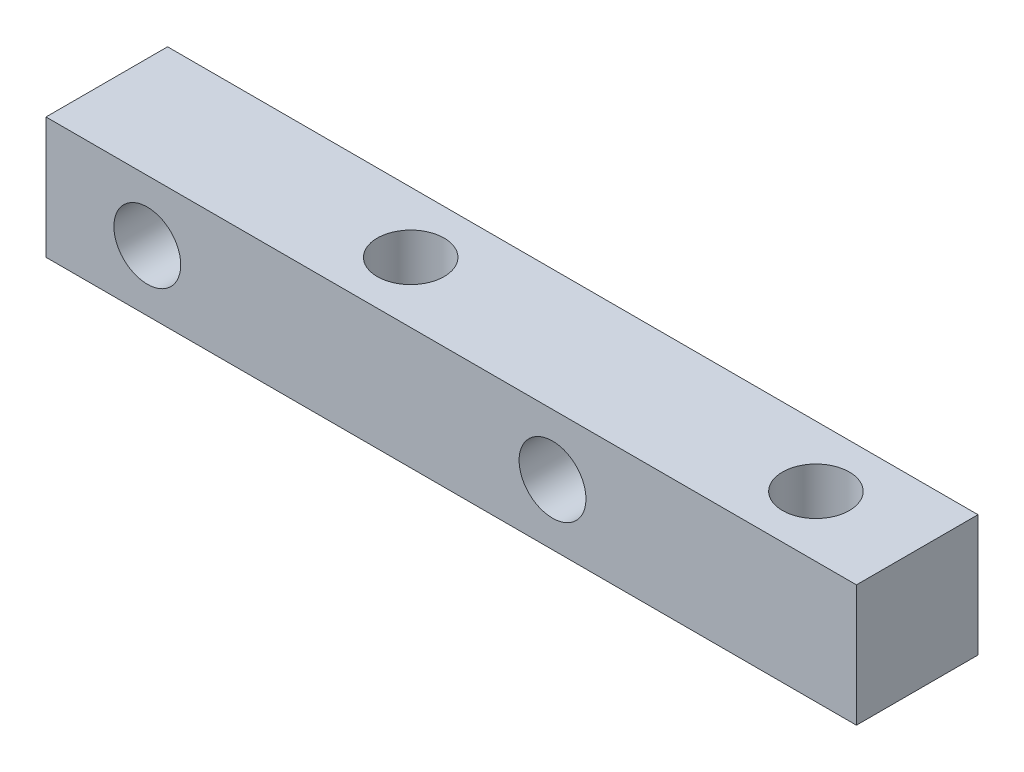
ISO-10303-21;
HEADER;
FILE_DESCRIPTION(('STEP AP214'),'2;1');
FILE_NAME('part.step','',(''),(''),'','','');
FILE_SCHEMA(('AUTOMOTIVE_DESIGN { 1 0 10303 214 1 1 1 1 }'));
ENDSEC;
DATA;
#1=APPLICATION_CONTEXT('core data for automotive mechanical design processes');
#2=APPLICATION_PROTOCOL_DEFINITION('international standard','automotive_design',2000,#1);
#3=PRODUCT_CONTEXT('',#1,'mechanical');
#4=PRODUCT('Part','Part','',(#3));
#5=PRODUCT_RELATED_PRODUCT_CATEGORY('part','',(#4));
#6=PRODUCT_DEFINITION_FORMATION('','',#4);
#7=PRODUCT_DEFINITION_CONTEXT('part definition',#1,'design');
#8=PRODUCT_DEFINITION('design','',#6,#7);
#9=PRODUCT_DEFINITION_SHAPE('','',#8);
#10=(LENGTH_UNIT() NAMED_UNIT(*) SI_UNIT(.MILLI.,.METRE.));
#11=(NAMED_UNIT(*) PLANE_ANGLE_UNIT() SI_UNIT($,.RADIAN.));
#12=(NAMED_UNIT(*) SI_UNIT($,.STERADIAN.) SOLID_ANGLE_UNIT());
#13=UNCERTAINTY_MEASURE_WITH_UNIT(LENGTH_MEASURE(1.E-05),#10,'distance_accuracy_value','');
#14=(GEOMETRIC_REPRESENTATION_CONTEXT(3) GLOBAL_UNCERTAINTY_ASSIGNED_CONTEXT((#13)) GLOBAL_UNIT_ASSIGNED_CONTEXT((#10,
#11,#12)) REPRESENTATION_CONTEXT('',''));
#15=CARTESIAN_POINT('',(0.,0.,0.));
#16=DIRECTION('',(0.,0.,1.));
#17=DIRECTION('',(1.,0.,0.));
#18=AXIS2_PLACEMENT_3D('',#15,#16,#17);
#19=CARTESIAN_POINT('',(40.,-3.,3.));
#20=DIRECTION('',(0.,0.,-1.));
#21=DIRECTION('',(-1.,0.,0.));
#22=AXIS2_PLACEMENT_3D('',#19,#20,#21);
#23=PLANE('',#22);
#24=CARTESIAN_POINT('',(5.,0.,3.));
#25=DIRECTION('',(0.,0.,1.));
#26=DIRECTION('',(1.,0.,0.));
#27=AXIS2_PLACEMENT_3D('',#24,#25,#26);
#28=CIRCLE('',#27,1.65);
#29=CARTESIAN_POINT('',(6.65,0.,3.));
#30=VERTEX_POINT('',#29);
#31=EDGE_CURVE('E125',#30,#30,#28,.T.);
#32=ORIENTED_EDGE('',*,*,#31,.F.);
#33=EDGE_LOOP('',(#32));
#34=FACE_BOUND('',#33,.T.);
#35=CARTESIAN_POINT('',(25.,0.,3.));
#36=DIRECTION('',(0.,0.,1.));
#37=DIRECTION('',(1.,0.,0.));
#38=AXIS2_PLACEMENT_3D('',#35,#36,#37);
#39=CIRCLE('',#38,1.65);
#40=CARTESIAN_POINT('',(26.65,0.,3.));
#41=VERTEX_POINT('',#40);
#42=EDGE_CURVE('E121',#41,#41,#39,.T.);
#43=ORIENTED_EDGE('',*,*,#42,.F.);
#44=EDGE_LOOP('',(#43));
#45=FACE_BOUND('',#44,.T.);
#46=DIRECTION('',(0.,-1.,0.));
#47=VECTOR('',#46,1.);
#48=CARTESIAN_POINT('',(0.,-3.,3.));
#49=LINE('',#48,#47);
#50=CARTESIAN_POINT('',(0.,3.,3.));
#51=VERTEX_POINT('',#50);
#52=CARTESIAN_POINT('',(0.,-3.,3.));
#53=VERTEX_POINT('',#52);
#54=EDGE_CURVE('E104',#51,#53,#49,.T.);
#55=ORIENTED_EDGE('',*,*,#54,.T.);
#56=DIRECTION('',(-1.,0.,0.));
#57=VECTOR('',#56,1.);
#58=CARTESIAN_POINT('',(40.,-3.,3.));
#59=LINE('',#58,#57);
#60=CARTESIAN_POINT('',(40.,-3.,3.));
#61=VERTEX_POINT('',#60);
#62=EDGE_CURVE('E11',#61,#53,#59,.T.);
#63=ORIENTED_EDGE('',*,*,#62,.F.);
#64=DIRECTION('',(0.,-1.,0.));
#65=VECTOR('',#64,1.);
#66=CARTESIAN_POINT('',(40.,-3.,3.));
#67=LINE('',#66,#65);
#68=CARTESIAN_POINT('',(40.,3.,3.));
#69=VERTEX_POINT('',#68);
#70=EDGE_CURVE('E92',#69,#61,#67,.T.);
#71=ORIENTED_EDGE('',*,*,#70,.F.);
#72=DIRECTION('',(-1.,0.,0.));
#73=VECTOR('',#72,1.);
#74=CARTESIAN_POINT('',(40.,3.,3.));
#75=LINE('',#74,#73);
#76=EDGE_CURVE('E100',#69,#51,#75,.T.);
#77=ORIENTED_EDGE('',*,*,#76,.T.);
#78=EDGE_LOOP('',(#55,#63,#71,#77));
#79=FACE_BOUND('',#78,.T.);
#80=ADVANCED_FACE('F41',(#34,#45,#79),#23,.F.);
#81=CARTESIAN_POINT('',(40.,-3.,-3.));
#82=DIRECTION('',(0.,1.,0.));
#83=DIRECTION('',(0.,0.,1.));
#84=AXIS2_PLACEMENT_3D('',#81,#82,#83);
#85=PLANE('',#84);
#86=CARTESIAN_POINT('',(15.,-3.,0.));
#87=DIRECTION('',(0.,1.,0.));
#88=DIRECTION('',(0.,0.,1.));
#89=AXIS2_PLACEMENT_3D('',#86,#87,#88);
#90=CIRCLE('',#89,1.65);
#91=CARTESIAN_POINT('',(15.,-3.,1.65));
#92=VERTEX_POINT('',#91);
#93=EDGE_CURVE('E122',#92,#92,#90,.T.);
#94=ORIENTED_EDGE('',*,*,#93,.T.);
#95=EDGE_LOOP('',(#94));
#96=FACE_BOUND('',#95,.T.);
#97=CARTESIAN_POINT('',(35.,-3.,0.));
#98=DIRECTION('',(0.,1.,0.));
#99=DIRECTION('',(0.,0.,1.));
#100=AXIS2_PLACEMENT_3D('',#97,#98,#99);
#101=CIRCLE('',#100,1.65);
#102=CARTESIAN_POINT('',(35.,-3.,1.65));
#103=VERTEX_POINT('',#102);
#104=EDGE_CURVE('E130',#103,#103,#101,.T.);
#105=ORIENTED_EDGE('',*,*,#104,.T.);
#106=EDGE_LOOP('',(#105));
#107=FACE_BOUND('',#106,.T.);
#108=DIRECTION('',(0.,0.,-1.));
#109=VECTOR('',#108,1.);
#110=CARTESIAN_POINT('',(0.,-3.,-3.));
#111=LINE('',#110,#109);
#112=CARTESIAN_POINT('',(0.,-3.,-3.));
#113=VERTEX_POINT('',#112);
#114=EDGE_CURVE('E96',#53,#113,#111,.T.);
#115=ORIENTED_EDGE('',*,*,#114,.T.);
#116=DIRECTION('',(-1.,0.,0.));
#117=VECTOR('',#116,1.);
#118=CARTESIAN_POINT('',(40.,-3.,-3.));
#119=LINE('',#118,#117);
#120=CARTESIAN_POINT('',(40.,-3.,-3.));
#121=VERTEX_POINT('',#120);
#122=EDGE_CURVE('E49',#121,#113,#119,.T.);
#123=ORIENTED_EDGE('',*,*,#122,.F.);
#124=DIRECTION('',(0.,0.,-1.));
#125=VECTOR('',#124,1.);
#126=CARTESIAN_POINT('',(40.,-3.,-3.));
#127=LINE('',#126,#125);
#128=EDGE_CURVE('E87',#61,#121,#127,.T.);
#129=ORIENTED_EDGE('',*,*,#128,.F.);
#130=ORIENTED_EDGE('',*,*,#62,.T.);
#131=EDGE_LOOP('',(#115,#123,#129,#130));
#132=FACE_BOUND('',#131,.T.);
#133=ADVANCED_FACE('F95',(#96,#107,#132),#85,.F.);
#134=CARTESIAN_POINT('',(40.,-3.,-3.));
#135=DIRECTION('',(0.,0.,1.));
#136=DIRECTION('',(1.,0.,0.));
#137=AXIS2_PLACEMENT_3D('',#134,#135,#136);
#138=PLANE('',#137);
#139=CARTESIAN_POINT('',(5.,0.,-3.));
#140=DIRECTION('',(0.,0.,1.));
#141=DIRECTION('',(1.,0.,0.));
#142=AXIS2_PLACEMENT_3D('',#139,#140,#141);
#143=CIRCLE('',#142,1.65);
#144=CARTESIAN_POINT('',(6.65,0.,-3.));
#145=VERTEX_POINT('',#144);
#146=EDGE_CURVE('E107',#145,#145,#143,.T.);
#147=ORIENTED_EDGE('',*,*,#146,.T.);
#148=EDGE_LOOP('',(#147));
#149=FACE_BOUND('',#148,.T.);
#150=CARTESIAN_POINT('',(25.,0.,-3.));
#151=DIRECTION('',(0.,0.,1.));
#152=DIRECTION('',(1.,0.,0.));
#153=AXIS2_PLACEMENT_3D('',#150,#151,#152);
#154=CIRCLE('',#153,1.65);
#155=CARTESIAN_POINT('',(26.65,0.,-3.));
#156=VERTEX_POINT('',#155);
#157=EDGE_CURVE('E118',#156,#156,#154,.T.);
#158=ORIENTED_EDGE('',*,*,#157,.T.);
#159=EDGE_LOOP('',(#158));
#160=FACE_BOUND('',#159,.T.);
#161=DIRECTION('',(0.,1.,0.));
#162=VECTOR('',#161,1.);
#163=CARTESIAN_POINT('',(0.,-3.,-3.));
#164=LINE('',#163,#162);
#165=CARTESIAN_POINT('',(0.,3.,-3.));
#166=VERTEX_POINT('',#165);
#167=EDGE_CURVE('E74',#113,#166,#164,.T.);
#168=ORIENTED_EDGE('',*,*,#167,.T.);
#169=DIRECTION('',(-1.,0.,0.));
#170=VECTOR('',#169,1.);
#171=CARTESIAN_POINT('',(40.,3.,-3.));
#172=LINE('',#171,#170);
#173=CARTESIAN_POINT('',(40.,3.,-3.));
#174=VERTEX_POINT('',#173);
#175=EDGE_CURVE('E97',#174,#166,#172,.T.);
#176=ORIENTED_EDGE('',*,*,#175,.F.);
#177=DIRECTION('',(0.,1.,0.));
#178=VECTOR('',#177,1.);
#179=CARTESIAN_POINT('',(40.,-3.,-3.));
#180=LINE('',#179,#178);
#181=EDGE_CURVE('E90',#121,#174,#180,.T.);
#182=ORIENTED_EDGE('',*,*,#181,.F.);
#183=ORIENTED_EDGE('',*,*,#122,.T.);
#184=EDGE_LOOP('',(#168,#176,#182,#183));
#185=FACE_BOUND('',#184,.T.);
#186=ADVANCED_FACE('F98',(#149,#160,#185),#138,.F.);
#187=CARTESIAN_POINT('',(40.,3.,-3.));
#188=DIRECTION('',(0.,-1.,0.));
#189=DIRECTION('',(0.,0.,-1.));
#190=AXIS2_PLACEMENT_3D('',#187,#188,#189);
#191=PLANE('',#190);
#192=CARTESIAN_POINT('',(15.,3.,0.));
#193=DIRECTION('',(0.,1.,0.));
#194=DIRECTION('',(0.,0.,1.));
#195=AXIS2_PLACEMENT_3D('',#192,#193,#194);
#196=CIRCLE('',#195,1.65);
#197=CARTESIAN_POINT('',(15.,3.,1.65));
#198=VERTEX_POINT('',#197);
#199=EDGE_CURVE('E136',#198,#198,#196,.T.);
#200=ORIENTED_EDGE('',*,*,#199,.F.);
#201=EDGE_LOOP('',(#200));
#202=FACE_BOUND('',#201,.T.);
#203=CARTESIAN_POINT('',(35.,3.,0.));
#204=DIRECTION('',(0.,1.,0.));
#205=DIRECTION('',(0.,0.,1.));
#206=AXIS2_PLACEMENT_3D('',#203,#204,#205);
#207=CIRCLE('',#206,1.65);
#208=CARTESIAN_POINT('',(35.,3.,1.65));
#209=VERTEX_POINT('',#208);
#210=EDGE_CURVE('E133',#209,#209,#207,.T.);
#211=ORIENTED_EDGE('',*,*,#210,.F.);
#212=EDGE_LOOP('',(#211));
#213=FACE_BOUND('',#212,.T.);
#214=DIRECTION('',(0.,0.,1.));
#215=VECTOR('',#214,1.);
#216=CARTESIAN_POINT('',(0.,3.,-3.));
#217=LINE('',#216,#215);
#218=EDGE_CURVE('E80',#166,#51,#217,.T.);
#219=ORIENTED_EDGE('',*,*,#218,.T.);
#220=ORIENTED_EDGE('',*,*,#76,.F.);
#221=DIRECTION('',(0.,0.,1.));
#222=VECTOR('',#221,1.);
#223=CARTESIAN_POINT('',(40.,3.,-3.));
#224=LINE('',#223,#222);
#225=EDGE_CURVE('E57',#174,#69,#224,.T.);
#226=ORIENTED_EDGE('',*,*,#225,.F.);
#227=ORIENTED_EDGE('',*,*,#175,.T.);
#228=EDGE_LOOP('',(#219,#220,#226,#227));
#229=FACE_BOUND('',#228,.T.);
#230=ADVANCED_FACE('F112',(#202,#213,#229),#191,.F.);
#231=CARTESIAN_POINT('',(40.,0.,0.));
#232=DIRECTION('',(1.,0.,0.));
#233=DIRECTION('',(0.,0.,-1.));
#234=AXIS2_PLACEMENT_3D('',#231,#232,#233);
#235=PLANE('',#234);
#236=ORIENTED_EDGE('',*,*,#70,.T.);
#237=ORIENTED_EDGE('',*,*,#128,.T.);
#238=ORIENTED_EDGE('',*,*,#181,.T.);
#239=ORIENTED_EDGE('',*,*,#225,.T.);
#240=EDGE_LOOP('',(#236,#237,#238,#239));
#241=FACE_BOUND('',#240,.T.);
#242=ADVANCED_FACE('F88',(#241),#235,.T.);
#243=CARTESIAN_POINT('',(0.,0.,0.));
#244=DIRECTION('',(1.,0.,0.));
#245=DIRECTION('',(0.,0.,-1.));
#246=AXIS2_PLACEMENT_3D('',#243,#244,#245);
#247=PLANE('',#246);
#248=ORIENTED_EDGE('',*,*,#54,.F.);
#249=ORIENTED_EDGE('',*,*,#218,.F.);
#250=ORIENTED_EDGE('',*,*,#167,.F.);
#251=ORIENTED_EDGE('',*,*,#114,.F.);
#252=EDGE_LOOP('',(#248,#249,#250,#251));
#253=FACE_BOUND('',#252,.T.);
#254=ADVANCED_FACE('F115',(#253),#247,.F.);
#255=CARTESIAN_POINT('',(25.,0.,-3.));
#256=DIRECTION('',(0.,0.,1.));
#257=DIRECTION('',(1.,0.,0.));
#258=AXIS2_PLACEMENT_3D('',#255,#256,#257);
#259=CYLINDRICAL_SURFACE('',#258,1.65);
#260=ORIENTED_EDGE('',*,*,#157,.F.);
#261=EDGE_LOOP('',(#260));
#262=FACE_BOUND('',#261,.T.);
#263=ORIENTED_EDGE('',*,*,#42,.T.);
#264=EDGE_LOOP('',(#263));
#265=FACE_BOUND('',#264,.T.);
#266=ADVANCED_FACE('F163',(#262,#265),#259,.F.);
#267=CARTESIAN_POINT('',(5.,0.,-3.));
#268=DIRECTION('',(0.,0.,1.));
#269=DIRECTION('',(1.,0.,0.));
#270=AXIS2_PLACEMENT_3D('',#267,#268,#269);
#271=CYLINDRICAL_SURFACE('',#270,1.65);
#272=ORIENTED_EDGE('',*,*,#146,.F.);
#273=EDGE_LOOP('',(#272));
#274=FACE_BOUND('',#273,.T.);
#275=ORIENTED_EDGE('',*,*,#31,.T.);
#276=EDGE_LOOP('',(#275));
#277=FACE_BOUND('',#276,.T.);
#278=ADVANCED_FACE('F157',(#274,#277),#271,.F.);
#279=CARTESIAN_POINT('',(35.,-3.,0.));
#280=DIRECTION('',(0.,1.,0.));
#281=DIRECTION('',(0.,0.,1.));
#282=AXIS2_PLACEMENT_3D('',#279,#280,#281);
#283=CYLINDRICAL_SURFACE('',#282,1.65);
#284=ORIENTED_EDGE('',*,*,#104,.F.);
#285=EDGE_LOOP('',(#284));
#286=FACE_BOUND('',#285,.T.);
#287=ORIENTED_EDGE('',*,*,#210,.T.);
#288=EDGE_LOOP('',(#287));
#289=FACE_BOUND('',#288,.T.);
#290=ADVANCED_FACE('F147',(#286,#289),#283,.F.);
#291=CARTESIAN_POINT('',(15.,-3.,0.));
#292=DIRECTION('',(0.,1.,0.));
#293=DIRECTION('',(0.,0.,1.));
#294=AXIS2_PLACEMENT_3D('',#291,#292,#293);
#295=CYLINDRICAL_SURFACE('',#294,1.65);
#296=ORIENTED_EDGE('',*,*,#93,.F.);
#297=EDGE_LOOP('',(#296));
#298=FACE_BOUND('',#297,.T.);
#299=ORIENTED_EDGE('',*,*,#199,.T.);
#300=EDGE_LOOP('',(#299));
#301=FACE_BOUND('',#300,.T.);
#302=ADVANCED_FACE('F144',(#298,#301),#295,.F.);
#303=CLOSED_SHELL('',(#80,#133,#186,#230,#242,#254,#266,#278,#290,#302));
#304=MANIFOLD_SOLID_BREP('B2',#303);
#305=ADVANCED_BREP_SHAPE_REPRESENTATION('',(#18,#304),#14);
#306=SHAPE_DEFINITION_REPRESENTATION(#9,#305);
ENDSEC;
END-ISO-10303-21;
